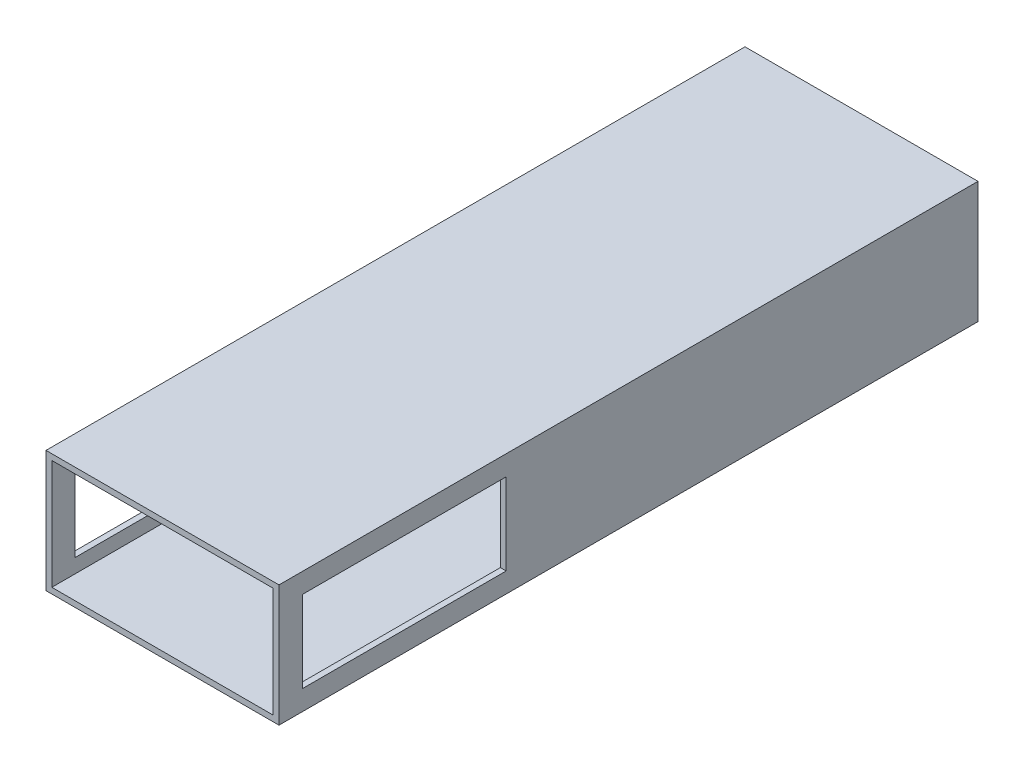
ISO-10303-21;
HEADER;
FILE_DESCRIPTION(('STEP AP214'),'2;1');
FILE_NAME('part.step','',(''),(''),'','','');
FILE_SCHEMA(('AUTOMOTIVE_DESIGN { 1 0 10303 214 1 1 1 1 }'));
ENDSEC;
DATA;
#1=APPLICATION_CONTEXT('core data for automotive mechanical design processes');
#2=APPLICATION_PROTOCOL_DEFINITION('international standard','automotive_design',2000,#1);
#3=PRODUCT_CONTEXT('',#1,'mechanical');
#4=PRODUCT('Part','Part','',(#3));
#5=PRODUCT_RELATED_PRODUCT_CATEGORY('part','',(#4));
#6=PRODUCT_DEFINITION_FORMATION('','',#4);
#7=PRODUCT_DEFINITION_CONTEXT('part definition',#1,'design');
#8=PRODUCT_DEFINITION('design','',#6,#7);
#9=PRODUCT_DEFINITION_SHAPE('','',#8);
#10=(LENGTH_UNIT() NAMED_UNIT(*) SI_UNIT(.MILLI.,.METRE.));
#11=(NAMED_UNIT(*) PLANE_ANGLE_UNIT() SI_UNIT($,.RADIAN.));
#12=(NAMED_UNIT(*) SI_UNIT($,.STERADIAN.) SOLID_ANGLE_UNIT());
#13=UNCERTAINTY_MEASURE_WITH_UNIT(LENGTH_MEASURE(1.E-05),#10,'distance_accuracy_value','');
#14=(GEOMETRIC_REPRESENTATION_CONTEXT(3) GLOBAL_UNCERTAINTY_ASSIGNED_CONTEXT((#13)) GLOBAL_UNIT_ASSIGNED_CONTEXT((#10,
#11,#12)) REPRESENTATION_CONTEXT('',''));
#15=CARTESIAN_POINT('',(0.,0.,0.));
#16=DIRECTION('',(0.,0.,1.));
#17=DIRECTION('',(1.,0.,0.));
#18=AXIS2_PLACEMENT_3D('',#15,#16,#17);
#19=CARTESIAN_POINT('',(0.,0.,120.));
#20=DIRECTION('',(0.,0.,1.));
#21=DIRECTION('',(1.,0.,0.));
#22=AXIS2_PLACEMENT_3D('',#19,#20,#21);
#23=PLANE('',#22);
#24=DIRECTION('',(0.,-1.,0.));
#25=VECTOR('',#24,1.);
#26=CARTESIAN_POINT('',(-20.,-10.4299999999999,120.));
#27=LINE('',#26,#25);
#28=CARTESIAN_POINT('',(-20.,10.43,120.));
#29=VERTEX_POINT('',#28);
#30=CARTESIAN_POINT('',(-20.,-10.4299999999999,120.));
#31=VERTEX_POINT('',#30);
#32=EDGE_CURVE('E238',#29,#31,#27,.T.);
#33=ORIENTED_EDGE('',*,*,#32,.T.);
#34=DIRECTION('',(1.,0.,0.));
#35=VECTOR('',#34,1.);
#36=CARTESIAN_POINT('',(20.,-10.4299999999999,120.));
#37=LINE('',#36,#35);
#38=CARTESIAN_POINT('',(20.,-10.4299999999999,120.));
#39=VERTEX_POINT('',#38);
#40=EDGE_CURVE('E241',#31,#39,#37,.T.);
#41=ORIENTED_EDGE('',*,*,#40,.T.);
#42=DIRECTION('',(0.,1.,0.));
#43=VECTOR('',#42,1.);
#44=CARTESIAN_POINT('',(20.,-10.4299999999999,120.));
#45=LINE('',#44,#43);
#46=CARTESIAN_POINT('',(20.,10.43,120.));
#47=VERTEX_POINT('',#46);
#48=EDGE_CURVE('E244',#39,#47,#45,.T.);
#49=ORIENTED_EDGE('',*,*,#48,.T.);
#50=DIRECTION('',(-1.,0.,0.));
#51=VECTOR('',#50,1.);
#52=CARTESIAN_POINT('',(20.,10.43,120.));
#53=LINE('',#52,#51);
#54=EDGE_CURVE('E246',#47,#29,#53,.T.);
#55=ORIENTED_EDGE('',*,*,#54,.T.);
#56=EDGE_LOOP('',(#33,#41,#49,#55));
#57=FACE_BOUND('',#56,.T.);
#58=DIRECTION('',(-1.,0.,0.));
#59=VECTOR('',#58,1.);
#60=CARTESIAN_POINT('',(19.,9.43000000000005,120.));
#61=LINE('',#60,#59);
#62=CARTESIAN_POINT('',(19.,9.43000000000005,120.));
#63=VERTEX_POINT('',#62);
#64=CARTESIAN_POINT('',(-19.,9.43000000000005,120.));
#65=VERTEX_POINT('',#64);
#66=EDGE_CURVE('E209',#63,#65,#61,.T.);
#67=ORIENTED_EDGE('',*,*,#66,.F.);
#68=DIRECTION('',(0.,1.,0.));
#69=VECTOR('',#68,1.);
#70=CARTESIAN_POINT('',(19.,-9.42999999999994,120.));
#71=LINE('',#70,#69);
#72=CARTESIAN_POINT('',(19.,-9.42999999999994,120.));
#73=VERTEX_POINT('',#72);
#74=EDGE_CURVE('E207',#73,#63,#71,.T.);
#75=ORIENTED_EDGE('',*,*,#74,.F.);
#76=DIRECTION('',(1.,0.,0.));
#77=VECTOR('',#76,1.);
#78=CARTESIAN_POINT('',(19.,-9.42999999999994,120.));
#79=LINE('',#78,#77);
#80=CARTESIAN_POINT('',(-19.,-9.42999999999994,120.));
#81=VERTEX_POINT('',#80);
#82=EDGE_CURVE('E215',#81,#73,#79,.T.);
#83=ORIENTED_EDGE('',*,*,#82,.F.);
#84=DIRECTION('',(0.,-1.,0.));
#85=VECTOR('',#84,1.);
#86=CARTESIAN_POINT('',(-19.,-9.42999999999994,120.));
#87=LINE('',#86,#85);
#88=EDGE_CURVE('E212',#65,#81,#87,.T.);
#89=ORIENTED_EDGE('',*,*,#88,.F.);
#90=EDGE_LOOP('',(#67,#75,#83,#89));
#91=FACE_BOUND('',#90,.T.);
#92=ADVANCED_FACE('F39',(#57,#91),#23,.T.);
#93=CARTESIAN_POINT('',(0.,0.,0.));
#94=DIRECTION('',(0.,0.,1.));
#95=DIRECTION('',(1.,0.,0.));
#96=AXIS2_PLACEMENT_3D('',#93,#94,#95);
#97=PLANE('',#96);
#98=DIRECTION('',(0.,-1.,0.));
#99=VECTOR('',#98,1.);
#100=CARTESIAN_POINT('',(-20.,-10.4299999999999,0.));
#101=LINE('',#100,#99);
#102=CARTESIAN_POINT('',(-20.,10.43,0.));
#103=VERTEX_POINT('',#102);
#104=CARTESIAN_POINT('',(-20.,-10.4299999999999,0.));
#105=VERTEX_POINT('',#104);
#106=EDGE_CURVE('E237',#103,#105,#101,.T.);
#107=ORIENTED_EDGE('',*,*,#106,.F.);
#108=DIRECTION('',(-1.,0.,0.));
#109=VECTOR('',#108,1.);
#110=CARTESIAN_POINT('',(20.,10.43,0.));
#111=LINE('',#110,#109);
#112=CARTESIAN_POINT('',(20.,10.43,0.));
#113=VERTEX_POINT('',#112);
#114=EDGE_CURVE('E242',#113,#103,#111,.T.);
#115=ORIENTED_EDGE('',*,*,#114,.F.);
#116=DIRECTION('',(0.,1.,0.));
#117=VECTOR('',#116,1.);
#118=CARTESIAN_POINT('',(20.,-10.4299999999999,0.));
#119=LINE('',#118,#117);
#120=CARTESIAN_POINT('',(20.,-10.4299999999999,0.));
#121=VERTEX_POINT('',#120);
#122=EDGE_CURVE('E253',#121,#113,#119,.T.);
#123=ORIENTED_EDGE('',*,*,#122,.F.);
#124=DIRECTION('',(1.,0.,0.));
#125=VECTOR('',#124,1.);
#126=CARTESIAN_POINT('',(20.,-10.4299999999999,0.));
#127=LINE('',#126,#125);
#128=EDGE_CURVE('E251',#105,#121,#127,.T.);
#129=ORIENTED_EDGE('',*,*,#128,.F.);
#130=EDGE_LOOP('',(#107,#115,#123,#129));
#131=FACE_BOUND('',#130,.T.);
#132=DIRECTION('',(0.,1.,0.));
#133=VECTOR('',#132,1.);
#134=CARTESIAN_POINT('',(19.,-9.42999999999994,0.));
#135=LINE('',#134,#133);
#136=CARTESIAN_POINT('',(19.,-9.42999999999994,0.));
#137=VERTEX_POINT('',#136);
#138=CARTESIAN_POINT('',(19.,9.43000000000005,0.));
#139=VERTEX_POINT('',#138);
#140=EDGE_CURVE('E206',#137,#139,#135,.T.);
#141=ORIENTED_EDGE('',*,*,#140,.T.);
#142=DIRECTION('',(-1.,0.,0.));
#143=VECTOR('',#142,1.);
#144=CARTESIAN_POINT('',(19.,9.43000000000005,0.));
#145=LINE('',#144,#143);
#146=CARTESIAN_POINT('',(-19.,9.43000000000005,0.));
#147=VERTEX_POINT('',#146);
#148=EDGE_CURVE('E220',#139,#147,#145,.T.);
#149=ORIENTED_EDGE('',*,*,#148,.T.);
#150=DIRECTION('',(0.,-1.,0.));
#151=VECTOR('',#150,1.);
#152=CARTESIAN_POINT('',(-19.,-9.42999999999994,0.));
#153=LINE('',#152,#151);
#154=CARTESIAN_POINT('',(-19.,-9.42999999999994,0.));
#155=VERTEX_POINT('',#154);
#156=EDGE_CURVE('E223',#147,#155,#153,.T.);
#157=ORIENTED_EDGE('',*,*,#156,.T.);
#158=DIRECTION('',(1.,0.,0.));
#159=VECTOR('',#158,1.);
#160=CARTESIAN_POINT('',(19.,-9.42999999999994,0.));
#161=LINE('',#160,#159);
#162=EDGE_CURVE('E210',#155,#137,#161,.T.);
#163=ORIENTED_EDGE('',*,*,#162,.T.);
#164=EDGE_LOOP('',(#141,#149,#157,#163));
#165=FACE_BOUND('',#164,.T.);
#166=ADVANCED_FACE('F291',(#131,#165),#97,.F.);
#167=CARTESIAN_POINT('',(-20.,-10.4299999999999,120.));
#168=DIRECTION('',(1.,0.,0.));
#169=DIRECTION('',(0.,0.,-1.));
#170=AXIS2_PLACEMENT_3D('',#167,#168,#169);
#171=PLANE('',#170);
#172=DIRECTION('',(0.,0.,-1.));
#173=VECTOR('',#172,1.);
#174=CARTESIAN_POINT('',(-20.,7.,81.));
#175=LINE('',#174,#173);
#176=CARTESIAN_POINT('',(-20.,7.,116.));
#177=VERTEX_POINT('',#176);
#178=CARTESIAN_POINT('',(-20.,7.,81.));
#179=VERTEX_POINT('',#178);
#180=EDGE_CURVE('E166',#177,#179,#175,.T.);
#181=ORIENTED_EDGE('',*,*,#180,.F.);
#182=DIRECTION('',(0.,1.,0.));
#183=VECTOR('',#182,1.);
#184=CARTESIAN_POINT('',(-20.,-7.,116.));
#185=LINE('',#184,#183);
#186=CARTESIAN_POINT('',(-20.,-7.,116.));
#187=VERTEX_POINT('',#186);
#188=EDGE_CURVE('E54',#187,#177,#185,.T.);
#189=ORIENTED_EDGE('',*,*,#188,.F.);
#190=DIRECTION('',(0.,0.,1.));
#191=VECTOR('',#190,1.);
#192=CARTESIAN_POINT('',(-20.,-7.,81.));
#193=LINE('',#192,#191);
#194=CARTESIAN_POINT('',(-20.,-7.,81.));
#195=VERTEX_POINT('',#194);
#196=EDGE_CURVE('E173',#195,#187,#193,.T.);
#197=ORIENTED_EDGE('',*,*,#196,.F.);
#198=DIRECTION('',(0.,-1.,0.));
#199=VECTOR('',#198,1.);
#200=CARTESIAN_POINT('',(-20.,-7.,81.));
#201=LINE('',#200,#199);
#202=EDGE_CURVE('E157',#179,#195,#201,.T.);
#203=ORIENTED_EDGE('',*,*,#202,.F.);
#204=EDGE_LOOP('',(#181,#189,#197,#203));
#205=FACE_BOUND('',#204,.T.);
#206=ORIENTED_EDGE('',*,*,#106,.T.);
#207=DIRECTION('',(0.,0.,-1.));
#208=VECTOR('',#207,1.);
#209=CARTESIAN_POINT('',(-20.,-10.4299999999999,120.));
#210=LINE('',#209,#208);
#211=EDGE_CURVE('E264',#31,#105,#210,.T.);
#212=ORIENTED_EDGE('',*,*,#211,.F.);
#213=ORIENTED_EDGE('',*,*,#32,.F.);
#214=DIRECTION('',(0.,0.,-1.));
#215=VECTOR('',#214,1.);
#216=CARTESIAN_POINT('',(-20.,10.43,120.));
#217=LINE('',#216,#215);
#218=EDGE_CURVE('E248',#29,#103,#217,.T.);
#219=ORIENTED_EDGE('',*,*,#218,.T.);
#220=EDGE_LOOP('',(#206,#212,#213,#219));
#221=FACE_BOUND('',#220,.T.);
#222=ADVANCED_FACE('F41',(#205,#221),#171,.F.);
#223=CARTESIAN_POINT('',(20.,-10.4299999999999,120.));
#224=DIRECTION('',(0.,1.,0.));
#225=DIRECTION('',(0.,0.,1.));
#226=AXIS2_PLACEMENT_3D('',#223,#224,#225);
#227=PLANE('',#226);
#228=ORIENTED_EDGE('',*,*,#128,.T.);
#229=DIRECTION('',(0.,0.,-1.));
#230=VECTOR('',#229,1.);
#231=CARTESIAN_POINT('',(20.,-10.4299999999999,120.));
#232=LINE('',#231,#230);
#233=EDGE_CURVE('E261',#39,#121,#232,.T.);
#234=ORIENTED_EDGE('',*,*,#233,.F.);
#235=ORIENTED_EDGE('',*,*,#40,.F.);
#236=ORIENTED_EDGE('',*,*,#211,.T.);
#237=EDGE_LOOP('',(#228,#234,#235,#236));
#238=FACE_BOUND('',#237,.T.);
#239=ADVANCED_FACE('F310',(#238),#227,.F.);
#240=CARTESIAN_POINT('',(20.,-10.4299999999999,120.));
#241=DIRECTION('',(-1.,0.,0.));
#242=DIRECTION('',(0.,0.,1.));
#243=AXIS2_PLACEMENT_3D('',#240,#241,#242);
#244=PLANE('',#243);
#245=DIRECTION('',(0.,0.,1.));
#246=VECTOR('',#245,1.);
#247=CARTESIAN_POINT('',(20.,-7.,120.));
#248=LINE('',#247,#246);
#249=CARTESIAN_POINT('',(20.,-7.,81.));
#250=VERTEX_POINT('',#249);
#251=CARTESIAN_POINT('',(20.,-7.,116.));
#252=VERTEX_POINT('',#251);
#253=EDGE_CURVE('E197',#250,#252,#248,.T.);
#254=ORIENTED_EDGE('',*,*,#253,.T.);
#255=DIRECTION('',(0.,1.,0.));
#256=VECTOR('',#255,1.);
#257=CARTESIAN_POINT('',(20.,-10.4299999999999,116.));
#258=LINE('',#257,#256);
#259=CARTESIAN_POINT('',(20.,7.,116.));
#260=VERTEX_POINT('',#259);
#261=EDGE_CURVE('E203',#252,#260,#258,.T.);
#262=ORIENTED_EDGE('',*,*,#261,.T.);
#263=DIRECTION('',(0.,0.,-1.));
#264=VECTOR('',#263,1.);
#265=CARTESIAN_POINT('',(20.,7.,120.));
#266=LINE('',#265,#264);
#267=CARTESIAN_POINT('',(20.,7.,81.));
#268=VERTEX_POINT('',#267);
#269=EDGE_CURVE('E187',#260,#268,#266,.T.);
#270=ORIENTED_EDGE('',*,*,#269,.T.);
#271=DIRECTION('',(0.,-1.,0.));
#272=VECTOR('',#271,1.);
#273=CARTESIAN_POINT('',(20.,-10.4299999999999,81.));
#274=LINE('',#273,#272);
#275=EDGE_CURVE('E192',#268,#250,#274,.T.);
#276=ORIENTED_EDGE('',*,*,#275,.T.);
#277=EDGE_LOOP('',(#254,#262,#270,#276));
#278=FACE_BOUND('',#277,.T.);
#279=ORIENTED_EDGE('',*,*,#122,.T.);
#280=DIRECTION('',(0.,0.,-1.));
#281=VECTOR('',#280,1.);
#282=CARTESIAN_POINT('',(20.,10.43,120.));
#283=LINE('',#282,#281);
#284=EDGE_CURVE('E258',#47,#113,#283,.T.);
#285=ORIENTED_EDGE('',*,*,#284,.F.);
#286=ORIENTED_EDGE('',*,*,#48,.F.);
#287=ORIENTED_EDGE('',*,*,#233,.T.);
#288=EDGE_LOOP('',(#279,#285,#286,#287));
#289=FACE_BOUND('',#288,.T.);
#290=ADVANCED_FACE('F307',(#278,#289),#244,.F.);
#291=CARTESIAN_POINT('',(20.,10.43,120.));
#292=DIRECTION('',(0.,-1.,0.));
#293=DIRECTION('',(0.,0.,-1.));
#294=AXIS2_PLACEMENT_3D('',#291,#292,#293);
#295=PLANE('',#294);
#296=ORIENTED_EDGE('',*,*,#114,.T.);
#297=ORIENTED_EDGE('',*,*,#218,.F.);
#298=ORIENTED_EDGE('',*,*,#54,.F.);
#299=ORIENTED_EDGE('',*,*,#284,.T.);
#300=EDGE_LOOP('',(#296,#297,#298,#299));
#301=FACE_BOUND('',#300,.T.);
#302=ADVANCED_FACE('F304',(#301),#295,.F.);
#303=CARTESIAN_POINT('',(19.,-9.42999999999994,120.));
#304=DIRECTION('',(-1.,0.,0.));
#305=DIRECTION('',(0.,0.,1.));
#306=AXIS2_PLACEMENT_3D('',#303,#304,#305);
#307=PLANE('',#306);
#308=DIRECTION('',(0.,1.,0.));
#309=VECTOR('',#308,1.);
#310=CARTESIAN_POINT('',(19.,-9.42999999999994,116.));
#311=LINE('',#310,#309);
#312=CARTESIAN_POINT('',(19.,-7.,116.));
#313=VERTEX_POINT('',#312);
#314=CARTESIAN_POINT('',(19.,7.,116.));
#315=VERTEX_POINT('',#314);
#316=EDGE_CURVE('E200',#313,#315,#311,.T.);
#317=ORIENTED_EDGE('',*,*,#316,.F.);
#318=DIRECTION('',(0.,0.,1.));
#319=VECTOR('',#318,1.);
#320=CARTESIAN_POINT('',(19.,-7.,120.));
#321=LINE('',#320,#319);
#322=CARTESIAN_POINT('',(19.,-7.,81.));
#323=VERTEX_POINT('',#322);
#324=EDGE_CURVE('E195',#323,#313,#321,.T.);
#325=ORIENTED_EDGE('',*,*,#324,.F.);
#326=DIRECTION('',(0.,-1.,0.));
#327=VECTOR('',#326,1.);
#328=CARTESIAN_POINT('',(19.,-9.42999999999994,81.));
#329=LINE('',#328,#327);
#330=CARTESIAN_POINT('',(19.,7.,81.));
#331=VERTEX_POINT('',#330);
#332=EDGE_CURVE('E190',#331,#323,#329,.T.);
#333=ORIENTED_EDGE('',*,*,#332,.F.);
#334=DIRECTION('',(0.,0.,-1.));
#335=VECTOR('',#334,1.);
#336=CARTESIAN_POINT('',(19.,7.,120.));
#337=LINE('',#336,#335);
#338=EDGE_CURVE('E185',#315,#331,#337,.T.);
#339=ORIENTED_EDGE('',*,*,#338,.F.);
#340=EDGE_LOOP('',(#317,#325,#333,#339));
#341=FACE_BOUND('',#340,.T.);
#342=ORIENTED_EDGE('',*,*,#140,.F.);
#343=DIRECTION('',(0.,0.,-1.));
#344=VECTOR('',#343,1.);
#345=CARTESIAN_POINT('',(19.,-9.42999999999994,120.));
#346=LINE('',#345,#344);
#347=EDGE_CURVE('E217',#73,#137,#346,.T.);
#348=ORIENTED_EDGE('',*,*,#347,.F.);
#349=ORIENTED_EDGE('',*,*,#74,.T.);
#350=DIRECTION('',(0.,0.,-1.));
#351=VECTOR('',#350,1.);
#352=CARTESIAN_POINT('',(19.,9.43000000000005,120.));
#353=LINE('',#352,#351);
#354=EDGE_CURVE('E234',#63,#139,#353,.T.);
#355=ORIENTED_EDGE('',*,*,#354,.T.);
#356=EDGE_LOOP('',(#342,#348,#349,#355));
#357=FACE_BOUND('',#356,.T.);
#358=ADVANCED_FACE('F301',(#341,#357),#307,.T.);
#359=CARTESIAN_POINT('',(19.,9.43000000000005,120.));
#360=DIRECTION('',(0.,-1.,0.));
#361=DIRECTION('',(0.,0.,-1.));
#362=AXIS2_PLACEMENT_3D('',#359,#360,#361);
#363=PLANE('',#362);
#364=ORIENTED_EDGE('',*,*,#148,.F.);
#365=ORIENTED_EDGE('',*,*,#354,.F.);
#366=ORIENTED_EDGE('',*,*,#66,.T.);
#367=DIRECTION('',(0.,0.,-1.));
#368=VECTOR('',#367,1.);
#369=CARTESIAN_POINT('',(-19.,9.43000000000005,120.));
#370=LINE('',#369,#368);
#371=EDGE_CURVE('E232',#65,#147,#370,.T.);
#372=ORIENTED_EDGE('',*,*,#371,.T.);
#373=EDGE_LOOP('',(#364,#365,#366,#372));
#374=FACE_BOUND('',#373,.T.);
#375=ADVANCED_FACE('F340',(#374),#363,.T.);
#376=CARTESIAN_POINT('',(-19.,-9.42999999999994,120.));
#377=DIRECTION('',(1.,0.,0.));
#378=DIRECTION('',(0.,0.,-1.));
#379=AXIS2_PLACEMENT_3D('',#376,#377,#378);
#380=PLANE('',#379);
#381=DIRECTION('',(0.,-1.,0.));
#382=VECTOR('',#381,1.);
#383=CARTESIAN_POINT('',(-19.,-9.42999999999994,116.));
#384=LINE('',#383,#382);
#385=CARTESIAN_POINT('',(-19.,7.,116.));
#386=VERTEX_POINT('',#385);
#387=CARTESIAN_POINT('',(-19.,-7.,116.));
#388=VERTEX_POINT('',#387);
#389=EDGE_CURVE('E11',#386,#388,#384,.T.);
#390=ORIENTED_EDGE('',*,*,#389,.F.);
#391=DIRECTION('',(0.,0.,1.));
#392=VECTOR('',#391,1.);
#393=CARTESIAN_POINT('',(-19.,7.,120.));
#394=LINE('',#393,#392);
#395=CARTESIAN_POINT('',(-19.,7.,81.));
#396=VERTEX_POINT('',#395);
#397=EDGE_CURVE('E267',#396,#386,#394,.T.);
#398=ORIENTED_EDGE('',*,*,#397,.F.);
#399=DIRECTION('',(0.,1.,0.));
#400=VECTOR('',#399,1.);
#401=CARTESIAN_POINT('',(-19.,-9.42999999999994,81.));
#402=LINE('',#401,#400);
#403=CARTESIAN_POINT('',(-19.,-7.,81.));
#404=VERTEX_POINT('',#403);
#405=EDGE_CURVE('E160',#404,#396,#402,.T.);
#406=ORIENTED_EDGE('',*,*,#405,.F.);
#407=DIRECTION('',(0.,0.,-1.));
#408=VECTOR('',#407,1.);
#409=CARTESIAN_POINT('',(-19.,-7.,120.));
#410=LINE('',#409,#408);
#411=EDGE_CURVE('E47',#388,#404,#410,.T.);
#412=ORIENTED_EDGE('',*,*,#411,.F.);
#413=EDGE_LOOP('',(#390,#398,#406,#412));
#414=FACE_BOUND('',#413,.T.);
#415=ORIENTED_EDGE('',*,*,#156,.F.);
#416=ORIENTED_EDGE('',*,*,#371,.F.);
#417=ORIENTED_EDGE('',*,*,#88,.T.);
#418=DIRECTION('',(0.,0.,-1.));
#419=VECTOR('',#418,1.);
#420=CARTESIAN_POINT('',(-19.,-9.42999999999994,120.));
#421=LINE('',#420,#419);
#422=EDGE_CURVE('E230',#81,#155,#421,.T.);
#423=ORIENTED_EDGE('',*,*,#422,.T.);
#424=EDGE_LOOP('',(#415,#416,#417,#423));
#425=FACE_BOUND('',#424,.T.);
#426=ADVANCED_FACE('F275',(#414,#425),#380,.T.);
#427=CARTESIAN_POINT('',(19.,-9.42999999999994,120.));
#428=DIRECTION('',(0.,1.,0.));
#429=DIRECTION('',(-1.,0.,0.));
#430=AXIS2_PLACEMENT_3D('',#427,#428,#429);
#431=PLANE('',#430);
#432=ORIENTED_EDGE('',*,*,#162,.F.);
#433=ORIENTED_EDGE('',*,*,#422,.F.);
#434=ORIENTED_EDGE('',*,*,#82,.T.);
#435=ORIENTED_EDGE('',*,*,#347,.T.);
#436=EDGE_LOOP('',(#432,#433,#434,#435));
#437=FACE_BOUND('',#436,.T.);
#438=ADVANCED_FACE('F335',(#437),#431,.T.);
#439=CARTESIAN_POINT('',(99.9999999999999,7.,81.));
#440=DIRECTION('',(0.,1.,0.));
#441=DIRECTION('',(0.,0.,1.));
#442=AXIS2_PLACEMENT_3D('',#439,#440,#441);
#443=PLANE('',#442);
#444=ORIENTED_EDGE('',*,*,#397,.T.);
#445=DIRECTION('',(-1.,0.,0.));
#446=VECTOR('',#445,1.);
#447=CARTESIAN_POINT('',(99.9999999999999,7.,116.));
#448=LINE('',#447,#446);
#449=EDGE_CURVE('E168',#386,#177,#448,.T.);
#450=ORIENTED_EDGE('',*,*,#449,.T.);
#451=ORIENTED_EDGE('',*,*,#180,.T.);
#452=DIRECTION('',(-1.,0.,0.));
#453=VECTOR('',#452,1.);
#454=CARTESIAN_POINT('',(99.9999999999999,7.,81.));
#455=LINE('',#454,#453);
#456=EDGE_CURVE('E152',#396,#179,#455,.T.);
#457=ORIENTED_EDGE('',*,*,#456,.F.);
#458=EDGE_LOOP('',(#444,#450,#451,#457));
#459=FACE_BOUND('',#458,.T.);
#460=ADVANCED_FACE('F167',(#459),#443,.F.);
#461=CARTESIAN_POINT('',(99.9999999999999,-7.,81.));
#462=DIRECTION('',(0.,0.,-1.));
#463=DIRECTION('',(-1.,0.,0.));
#464=AXIS2_PLACEMENT_3D('',#461,#462,#463);
#465=PLANE('',#464);
#466=ORIENTED_EDGE('',*,*,#405,.T.);
#467=ORIENTED_EDGE('',*,*,#456,.T.);
#468=ORIENTED_EDGE('',*,*,#202,.T.);
#469=DIRECTION('',(-1.,0.,0.));
#470=VECTOR('',#469,1.);
#471=CARTESIAN_POINT('',(99.9999999999999,-7.,81.));
#472=LINE('',#471,#470);
#473=EDGE_CURVE('E182',#404,#195,#472,.T.);
#474=ORIENTED_EDGE('',*,*,#473,.F.);
#475=EDGE_LOOP('',(#466,#467,#468,#474));
#476=FACE_BOUND('',#475,.T.);
#477=ADVANCED_FACE('F154',(#476),#465,.F.);
#478=CARTESIAN_POINT('',(99.9999999999999,-7.,81.));
#479=DIRECTION('',(0.,-1.,0.));
#480=DIRECTION('',(0.,0.,-1.));
#481=AXIS2_PLACEMENT_3D('',#478,#479,#480);
#482=PLANE('',#481);
#483=ORIENTED_EDGE('',*,*,#411,.T.);
#484=ORIENTED_EDGE('',*,*,#473,.T.);
#485=ORIENTED_EDGE('',*,*,#196,.T.);
#486=DIRECTION('',(-1.,0.,0.));
#487=VECTOR('',#486,1.);
#488=CARTESIAN_POINT('',(99.9999999999999,-7.,116.));
#489=LINE('',#488,#487);
#490=EDGE_CURVE('E178',#388,#187,#489,.T.);
#491=ORIENTED_EDGE('',*,*,#490,.F.);
#492=EDGE_LOOP('',(#483,#484,#485,#491));
#493=FACE_BOUND('',#492,.T.);
#494=ADVANCED_FACE('F272',(#493),#482,.F.);
#495=CARTESIAN_POINT('',(99.9999999999999,-7.,116.));
#496=DIRECTION('',(0.,0.,1.));
#497=DIRECTION('',(1.,0.,0.));
#498=AXIS2_PLACEMENT_3D('',#495,#496,#497);
#499=PLANE('',#498);
#500=ORIENTED_EDGE('',*,*,#389,.T.);
#501=ORIENTED_EDGE('',*,*,#490,.T.);
#502=ORIENTED_EDGE('',*,*,#188,.T.);
#503=ORIENTED_EDGE('',*,*,#449,.F.);
#504=EDGE_LOOP('',(#500,#501,#502,#503));
#505=FACE_BOUND('',#504,.T.);
#506=ADVANCED_FACE('F277',(#505),#499,.F.);
#507=EDGE_CURVE('E180',#252,#313,#489,.T.);
#508=ORIENTED_EDGE('',*,*,#507,.T.);
#509=ORIENTED_EDGE('',*,*,#316,.T.);
#510=EDGE_CURVE('E163',#260,#315,#448,.T.);
#511=ORIENTED_EDGE('',*,*,#510,.F.);
#512=ORIENTED_EDGE('',*,*,#261,.F.);
#513=EDGE_LOOP('',(#508,#509,#511,#512));
#514=FACE_BOUND('',#513,.T.);
#515=ADVANCED_FACE('F279',(#514),#499,.F.);
#516=EDGE_CURVE('E181',#250,#323,#472,.T.);
#517=ORIENTED_EDGE('',*,*,#516,.T.);
#518=ORIENTED_EDGE('',*,*,#324,.T.);
#519=ORIENTED_EDGE('',*,*,#507,.F.);
#520=ORIENTED_EDGE('',*,*,#253,.F.);
#521=EDGE_LOOP('',(#517,#518,#519,#520));
#522=FACE_BOUND('',#521,.T.);
#523=ADVANCED_FACE('F285',(#522),#482,.F.);
#524=EDGE_CURVE('E62',#268,#331,#455,.T.);
#525=ORIENTED_EDGE('',*,*,#524,.T.);
#526=ORIENTED_EDGE('',*,*,#332,.T.);
#527=ORIENTED_EDGE('',*,*,#516,.F.);
#528=ORIENTED_EDGE('',*,*,#275,.F.);
#529=EDGE_LOOP('',(#525,#526,#527,#528));
#530=FACE_BOUND('',#529,.T.);
#531=ADVANCED_FACE('F367',(#530),#465,.F.);
#532=ORIENTED_EDGE('',*,*,#510,.T.);
#533=ORIENTED_EDGE('',*,*,#338,.T.);
#534=ORIENTED_EDGE('',*,*,#524,.F.);
#535=ORIENTED_EDGE('',*,*,#269,.F.);
#536=EDGE_LOOP('',(#532,#533,#534,#535));
#537=FACE_BOUND('',#536,.T.);
#538=ADVANCED_FACE('F369',(#537),#443,.F.);
#539=CLOSED_SHELL('',(#92,#166,#222,#239,#290,#302,#358,#375,#426,#438,#460,#477,#494,#506,#515,
#523,#531,#538));
#540=MANIFOLD_SOLID_BREP('B2',#539);
#541=ADVANCED_BREP_SHAPE_REPRESENTATION('',(#18,#540),#14);
#542=SHAPE_DEFINITION_REPRESENTATION(#9,#541);
ENDSEC;
END-ISO-10303-21;
